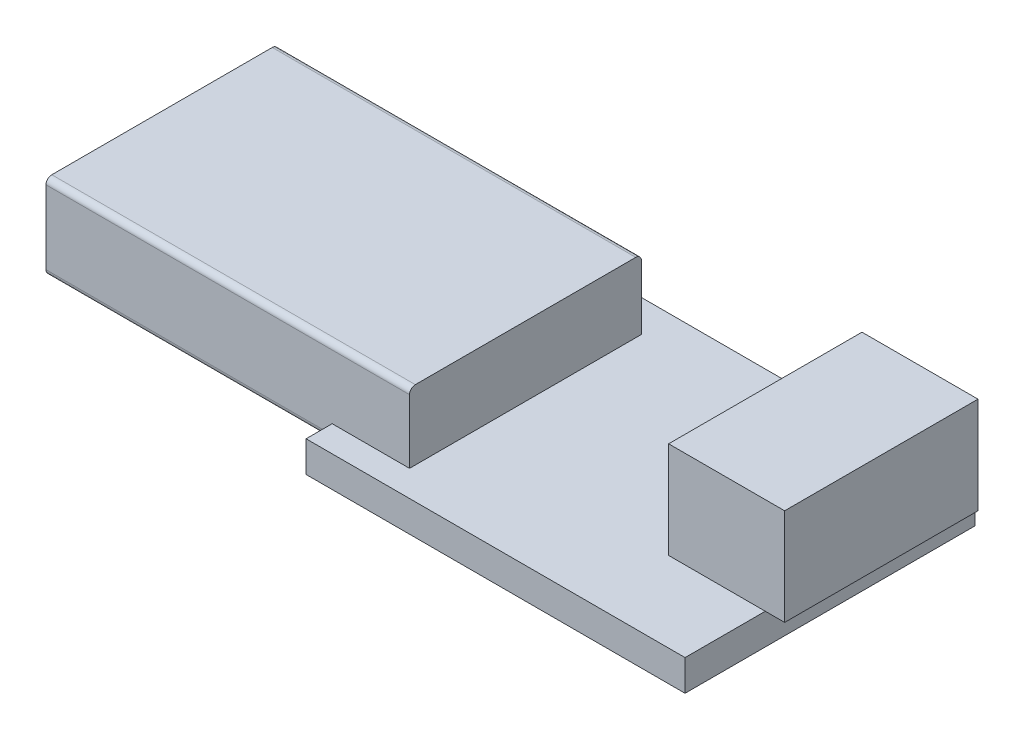
ISO-10303-21;
HEADER;
FILE_DESCRIPTION(('STEP AP214'),'2;1');
FILE_NAME('part.step','',(''),(''),'','','');
FILE_SCHEMA(('AUTOMOTIVE_DESIGN { 1 0 10303 214 1 1 1 1 }'));
ENDSEC;
DATA;
#1=APPLICATION_CONTEXT('core data for automotive mechanical design processes');
#2=APPLICATION_PROTOCOL_DEFINITION('international standard','automotive_design',2000,#1);
#3=PRODUCT_CONTEXT('',#1,'mechanical');
#4=PRODUCT('Part','Part','',(#3));
#5=PRODUCT_RELATED_PRODUCT_CATEGORY('part','',(#4));
#6=PRODUCT_DEFINITION_FORMATION('','',#4);
#7=PRODUCT_DEFINITION_CONTEXT('part definition',#1,'design');
#8=PRODUCT_DEFINITION('design','',#6,#7);
#9=PRODUCT_DEFINITION_SHAPE('','',#8);
#10=(LENGTH_UNIT() NAMED_UNIT(*) SI_UNIT(.MILLI.,.METRE.));
#11=(NAMED_UNIT(*) PLANE_ANGLE_UNIT() SI_UNIT($,.RADIAN.));
#12=(NAMED_UNIT(*) SI_UNIT($,.STERADIAN.) SOLID_ANGLE_UNIT());
#13=UNCERTAINTY_MEASURE_WITH_UNIT(LENGTH_MEASURE(1.E-05),#10,'distance_accuracy_value','');
#14=(GEOMETRIC_REPRESENTATION_CONTEXT(3) GLOBAL_UNCERTAINTY_ASSIGNED_CONTEXT((#13)) GLOBAL_UNIT_ASSIGNED_CONTEXT((#10,
#11,#12)) REPRESENTATION_CONTEXT('',''));
#15=CARTESIAN_POINT('',(0.,0.,0.));
#16=DIRECTION('',(0.,0.,1.));
#17=DIRECTION('',(1.,0.,0.));
#18=AXIS2_PLACEMENT_3D('',#15,#16,#17);
#19=CARTESIAN_POINT('',(6.21665510863984,0.3,-5.55));
#20=DIRECTION('',(0.,-1.,0.));
#21=DIRECTION('',(0.,0.,-1.));
#22=AXIS2_PLACEMENT_3D('',#19,#20,#21);
#23=PLANE('',#22);
#24=DIRECTION('',(0.,0.,-1.));
#25=VECTOR('',#24,1.);
#26=CARTESIAN_POINT('',(-24.5,0.3,5.55));
#27=LINE('',#26,#25);
#28=CARTESIAN_POINT('',(-24.5,0.3,5.55));
#29=VERTEX_POINT('',#28);
#30=CARTESIAN_POINT('',(-24.5,0.3,-5.25));
#31=VERTEX_POINT('',#30);
#32=EDGE_CURVE('E241',#29,#31,#27,.T.);
#33=ORIENTED_EDGE('',*,*,#32,.T.);
#34=DIRECTION('',(-1.,0.,0.));
#35=VECTOR('',#34,1.);
#36=CARTESIAN_POINT('',(-24.6,0.3,-5.25));
#37=LINE('',#36,#35);
#38=CARTESIAN_POINT('',(-24.6,0.3,-5.25));
#39=VERTEX_POINT('',#38);
#40=EDGE_CURVE('E226',#31,#39,#37,.T.);
#41=ORIENTED_EDGE('',*,*,#40,.T.);
#42=DIRECTION('',(0.,0.,1.));
#43=VECTOR('',#42,1.);
#44=CARTESIAN_POINT('',(-24.6,0.3,-5.55));
#45=LINE('',#44,#43);
#46=CARTESIAN_POINT('',(-24.6,0.3,5.55));
#47=VERTEX_POINT('',#46);
#48=EDGE_CURVE('E298',#39,#47,#45,.T.);
#49=ORIENTED_EDGE('',*,*,#48,.T.);
#50=DIRECTION('',(-1.,0.,0.));
#51=VECTOR('',#50,1.);
#52=CARTESIAN_POINT('',(-7.8,0.3,5.55));
#53=LINE('',#52,#51);
#54=EDGE_CURVE('E236',#47,#29,#53,.F.);
#55=ORIENTED_EDGE('',*,*,#54,.T.);
#56=EDGE_LOOP('',(#33,#41,#49,#55));
#57=FACE_BOUND('',#56,.T.);
#58=ADVANCED_FACE('F35',(#57),#23,.F.);
#59=CARTESIAN_POINT('',(6.21665510863984,4.1,-5.55));
#60=DIRECTION('',(0.,0.,-1.));
#61=DIRECTION('',(-1.,0.,0.));
#62=AXIS2_PLACEMENT_3D('',#59,#60,#61);
#63=PLANE('',#62);
#64=DIRECTION('',(1.,0.,0.));
#65=VECTOR('',#64,1.);
#66=CARTESIAN_POINT('',(-36.1741090369842,2.3,-5.55));
#67=LINE('',#66,#65);
#68=CARTESIAN_POINT('',(-24.5,2.3,-5.55));
#69=VERTEX_POINT('',#68);
#70=CARTESIAN_POINT('',(-7.8,2.3,-5.55));
#71=VERTEX_POINT('',#70);
#72=EDGE_CURVE('E261',#69,#71,#67,.T.);
#73=ORIENTED_EDGE('',*,*,#72,.T.);
#74=DIRECTION('',(0.,1.,0.));
#75=VECTOR('',#74,1.);
#76=CARTESIAN_POINT('',(-7.8,4.1,-5.55));
#77=LINE('',#76,#75);
#78=CARTESIAN_POINT('',(-7.8,3.8,-5.55));
#79=VERTEX_POINT('',#78);
#80=EDGE_CURVE('E302',#71,#79,#77,.T.);
#81=ORIENTED_EDGE('',*,*,#80,.T.);
#82=DIRECTION('',(-1.,0.,0.));
#83=VECTOR('',#82,1.);
#84=CARTESIAN_POINT('',(-24.6,3.8,-5.55));
#85=LINE('',#84,#83);
#86=CARTESIAN_POINT('',(-24.6,3.8,-5.55));
#87=VERTEX_POINT('',#86);
#88=EDGE_CURVE('E401',#79,#87,#85,.T.);
#89=ORIENTED_EDGE('',*,*,#88,.T.);
#90=DIRECTION('',(0.,-1.,0.));
#91=VECTOR('',#90,1.);
#92=CARTESIAN_POINT('',(-24.6,4.1,-5.55));
#93=LINE('',#92,#91);
#94=CARTESIAN_POINT('',(-24.6,0.6,-5.55));
#95=VERTEX_POINT('',#94);
#96=EDGE_CURVE('E303',#87,#95,#93,.T.);
#97=ORIENTED_EDGE('',*,*,#96,.T.);
#98=DIRECTION('',(-1.,0.,0.));
#99=VECTOR('',#98,1.);
#100=CARTESIAN_POINT('',(-7.8,0.6,-5.55));
#101=LINE('',#100,#99);
#102=CARTESIAN_POINT('',(-24.5,0.6,-5.55));
#103=VERTEX_POINT('',#102);
#104=EDGE_CURVE('E399',#95,#103,#101,.F.);
#105=ORIENTED_EDGE('',*,*,#104,.T.);
#106=DIRECTION('',(0.,1.,0.));
#107=VECTOR('',#106,1.);
#108=CARTESIAN_POINT('',(-24.5,0.6,-5.55));
#109=LINE('',#108,#107);
#110=EDGE_CURVE('E50',#103,#69,#109,.T.);
#111=ORIENTED_EDGE('',*,*,#110,.T.);
#112=EDGE_LOOP('',(#73,#81,#89,#97,#105,#111));
#113=FACE_BOUND('',#112,.T.);
#114=ADVANCED_FACE('F525',(#113),#63,.F.);
#115=CARTESIAN_POINT('',(6.21665510863984,0.3,5.85));
#116=DIRECTION('',(0.,0.,1.));
#117=DIRECTION('',(1.,0.,0.));
#118=AXIS2_PLACEMENT_3D('',#115,#116,#117);
#119=PLANE('',#118);
#120=DIRECTION('',(1.,0.,0.));
#121=VECTOR('',#120,1.);
#122=CARTESIAN_POINT('',(-36.1741090369842,2.3,5.85));
#123=LINE('',#122,#121);
#124=CARTESIAN_POINT('',(-24.5,2.3,5.85));
#125=VERTEX_POINT('',#124);
#126=CARTESIAN_POINT('',(-7.8,2.3,5.85));
#127=VERTEX_POINT('',#126);
#128=EDGE_CURVE('E58',#125,#127,#123,.T.);
#129=ORIENTED_EDGE('',*,*,#128,.F.);
#130=DIRECTION('',(0.,-1.,0.));
#131=VECTOR('',#130,1.);
#132=CARTESIAN_POINT('',(-24.5,2.3,5.85));
#133=LINE('',#132,#131);
#134=CARTESIAN_POINT('',(-24.5,0.6,5.85));
#135=VERTEX_POINT('',#134);
#136=EDGE_CURVE('E253',#125,#135,#133,.T.);
#137=ORIENTED_EDGE('',*,*,#136,.T.);
#138=DIRECTION('',(-1.,0.,0.));
#139=VECTOR('',#138,1.);
#140=CARTESIAN_POINT('',(-24.6,0.6,5.85));
#141=LINE('',#140,#139);
#142=CARTESIAN_POINT('',(-24.6,0.6,5.85));
#143=VERTEX_POINT('',#142);
#144=EDGE_CURVE('E237',#135,#143,#141,.T.);
#145=ORIENTED_EDGE('',*,*,#144,.T.);
#146=DIRECTION('',(0.,1.,0.));
#147=VECTOR('',#146,1.);
#148=CARTESIAN_POINT('',(-24.6,0.3,5.85));
#149=LINE('',#148,#147);
#150=CARTESIAN_POINT('',(-24.6,3.8,5.85));
#151=VERTEX_POINT('',#150);
#152=EDGE_CURVE('E307',#143,#151,#149,.T.);
#153=ORIENTED_EDGE('',*,*,#152,.T.);
#154=DIRECTION('',(-1.,0.,0.));
#155=VECTOR('',#154,1.);
#156=CARTESIAN_POINT('',(-7.8,3.8,5.85));
#157=LINE('',#156,#155);
#158=CARTESIAN_POINT('',(-7.8,3.8,5.85));
#159=VERTEX_POINT('',#158);
#160=EDGE_CURVE('E385',#151,#159,#157,.F.);
#161=ORIENTED_EDGE('',*,*,#160,.T.);
#162=DIRECTION('',(0.,-1.,0.));
#163=VECTOR('',#162,1.);
#164=CARTESIAN_POINT('',(-7.8,0.3,5.85));
#165=LINE('',#164,#163);
#166=EDGE_CURVE('E305',#159,#127,#165,.T.);
#167=ORIENTED_EDGE('',*,*,#166,.T.);
#168=EDGE_LOOP('',(#129,#137,#145,#153,#161,#167));
#169=FACE_BOUND('',#168,.T.);
#170=ADVANCED_FACE('F530',(#169),#119,.F.);
#171=CARTESIAN_POINT('',(6.21665510863984,0.6,5.55));
#172=DIRECTION('',(1.,0.,0.));
#173=DIRECTION('',(0.,0.,-1.));
#174=AXIS2_PLACEMENT_3D('',#171,#172,#173);
#175=CYLINDRICAL_SURFACE('',#174,0.3);
#176=CARTESIAN_POINT('',(-24.5,0.6,5.55));
#177=DIRECTION('',(1.,0.,0.));
#178=DIRECTION('',(0.,0.,-1.));
#179=AXIS2_PLACEMENT_3D('',#176,#177,#178);
#180=CIRCLE('',#179,0.3);
#181=EDGE_CURVE('E255',#135,#29,#180,.T.);
#182=ORIENTED_EDGE('',*,*,#181,.T.);
#183=ORIENTED_EDGE('',*,*,#54,.F.);
#184=CARTESIAN_POINT('',(-24.6,0.6,5.55));
#185=DIRECTION('',(1.,0.,0.));
#186=DIRECTION('',(0.,0.,-1.));
#187=AXIS2_PLACEMENT_3D('',#184,#185,#186);
#188=CIRCLE('',#187,0.3);
#189=EDGE_CURVE('E436',#143,#47,#188,.T.);
#190=ORIENTED_EDGE('',*,*,#189,.F.);
#191=ORIENTED_EDGE('',*,*,#144,.F.);
#192=EDGE_LOOP('',(#182,#183,#190,#191));
#193=FACE_BOUND('',#192,.T.);
#194=ADVANCED_FACE('F552',(#193),#175,.F.);
#195=CARTESIAN_POINT('',(6.21665510863984,0.6,-5.25));
#196=DIRECTION('',(1.,0.,0.));
#197=DIRECTION('',(0.,0.,-1.));
#198=AXIS2_PLACEMENT_3D('',#195,#196,#197);
#199=CYLINDRICAL_SURFACE('',#198,0.3);
#200=CARTESIAN_POINT('',(-24.5,0.6,-5.25));
#201=DIRECTION('',(1.,0.,0.));
#202=DIRECTION('',(0.,0.,-1.));
#203=AXIS2_PLACEMENT_3D('',#200,#201,#202);
#204=CIRCLE('',#203,0.3);
#205=EDGE_CURVE('E231',#31,#103,#204,.T.);
#206=ORIENTED_EDGE('',*,*,#205,.T.);
#207=ORIENTED_EDGE('',*,*,#104,.F.);
#208=CARTESIAN_POINT('',(-24.6,0.6,-5.25));
#209=DIRECTION('',(1.,0.,0.));
#210=DIRECTION('',(0.,0.,-1.));
#211=AXIS2_PLACEMENT_3D('',#208,#209,#210);
#212=CIRCLE('',#211,0.3);
#213=EDGE_CURVE('E232',#39,#95,#212,.T.);
#214=ORIENTED_EDGE('',*,*,#213,.F.);
#215=ORIENTED_EDGE('',*,*,#40,.F.);
#216=EDGE_LOOP('',(#206,#207,#214,#215));
#217=FACE_BOUND('',#216,.T.);
#218=ADVANCED_FACE('F228',(#217),#199,.F.);
#219=CARTESIAN_POINT('',(0.,0.8,0.));
#220=DIRECTION('',(0.,-1.,0.));
#221=DIRECTION('',(0.,0.,-1.));
#222=AXIS2_PLACEMENT_3D('',#219,#220,#221);
#223=PLANE('',#222);
#224=DIRECTION('',(-1.,0.,0.));
#225=VECTOR('',#224,1.);
#226=CARTESIAN_POINT('',(10.8,0.8,-6.65));
#227=LINE('',#226,#225);
#228=CARTESIAN_POINT('',(9.8,0.8,-6.65));
#229=VERTEX_POINT('',#228);
#230=CARTESIAN_POINT('',(4.8,0.8,-6.65));
#231=VERTEX_POINT('',#230);
#232=EDGE_CURVE('E277',#229,#231,#227,.T.);
#233=ORIENTED_EDGE('',*,*,#232,.F.);
#234=DIRECTION('',(0.,0.,-1.));
#235=VECTOR('',#234,1.);
#236=CARTESIAN_POINT('',(9.8,0.8,7.5));
#237=LINE('',#236,#235);
#238=CARTESIAN_POINT('',(9.8,0.8,-7.5));
#239=VERTEX_POINT('',#238);
#240=EDGE_CURVE('E346',#229,#239,#237,.T.);
#241=ORIENTED_EDGE('',*,*,#240,.T.);
#242=DIRECTION('',(-1.,0.,0.));
#243=VECTOR('',#242,1.);
#244=CARTESIAN_POINT('',(-9.8,0.8,-7.5));
#245=LINE('',#244,#243);
#246=CARTESIAN_POINT('',(-9.8,0.8,-7.5));
#247=VERTEX_POINT('',#246);
#248=EDGE_CURVE('E344',#239,#247,#245,.T.);
#249=ORIENTED_EDGE('',*,*,#248,.T.);
#250=DIRECTION('',(0.,0.,1.));
#251=VECTOR('',#250,1.);
#252=CARTESIAN_POINT('',(-9.8,0.8,7.5));
#253=LINE('',#252,#251);
#254=CARTESIAN_POINT('',(-9.8,0.8,-5.85));
#255=VERTEX_POINT('',#254);
#256=EDGE_CURVE('E349',#247,#255,#253,.T.);
#257=ORIENTED_EDGE('',*,*,#256,.T.);
#258=DIRECTION('',(-1.,0.,0.));
#259=VECTOR('',#258,1.);
#260=CARTESIAN_POINT('',(0.,0.8,-5.85));
#261=LINE('',#260,#259);
#262=CARTESIAN_POINT('',(-5.8,0.8,-5.85));
#263=VERTEX_POINT('',#262);
#264=EDGE_CURVE('E373',#263,#255,#261,.T.);
#265=ORIENTED_EDGE('',*,*,#264,.F.);
#266=DIRECTION('',(0.,0.,-1.));
#267=VECTOR('',#266,1.);
#268=CARTESIAN_POINT('',(-5.8,0.8,0.));
#269=LINE('',#268,#267);
#270=CARTESIAN_POINT('',(-5.8,0.8,6.15));
#271=VERTEX_POINT('',#270);
#272=EDGE_CURVE('E376',#271,#263,#269,.T.);
#273=ORIENTED_EDGE('',*,*,#272,.F.);
#274=DIRECTION('',(1.,0.,0.));
#275=VECTOR('',#274,1.);
#276=CARTESIAN_POINT('',(0.,0.8,6.15));
#277=LINE('',#276,#275);
#278=CARTESIAN_POINT('',(-9.8,0.8,6.15));
#279=VERTEX_POINT('',#278);
#280=EDGE_CURVE('E379',#279,#271,#277,.T.);
#281=ORIENTED_EDGE('',*,*,#280,.F.);
#282=CARTESIAN_POINT('',(-9.8,0.8,7.5));
#283=VERTEX_POINT('',#282);
#284=EDGE_CURVE('E348',#279,#283,#253,.T.);
#285=ORIENTED_EDGE('',*,*,#284,.T.);
#286=DIRECTION('',(1.,0.,0.));
#287=VECTOR('',#286,1.);
#288=CARTESIAN_POINT('',(-9.8,0.8,7.5));
#289=LINE('',#288,#287);
#290=CARTESIAN_POINT('',(9.8,0.8,7.5));
#291=VERTEX_POINT('',#290);
#292=EDGE_CURVE('E351',#283,#291,#289,.T.);
#293=ORIENTED_EDGE('',*,*,#292,.T.);
#294=CARTESIAN_POINT('',(9.8,0.8,3.35));
#295=VERTEX_POINT('',#294);
#296=EDGE_CURVE('E341',#291,#295,#237,.T.);
#297=ORIENTED_EDGE('',*,*,#296,.T.);
#298=DIRECTION('',(1.,0.,0.));
#299=VECTOR('',#298,1.);
#300=CARTESIAN_POINT('',(10.8,0.8,3.35));
#301=LINE('',#300,#299);
#302=CARTESIAN_POINT('',(4.8,0.8,3.35));
#303=VERTEX_POINT('',#302);
#304=EDGE_CURVE('E268',#303,#295,#301,.T.);
#305=ORIENTED_EDGE('',*,*,#304,.F.);
#306=DIRECTION('',(0.,0.,1.));
#307=VECTOR('',#306,1.);
#308=CARTESIAN_POINT('',(4.8,0.8,-6.65));
#309=LINE('',#308,#307);
#310=EDGE_CURVE('E281',#231,#303,#309,.T.);
#311=ORIENTED_EDGE('',*,*,#310,.F.);
#312=EDGE_LOOP('',(#233,#241,#249,#257,#265,#273,#281,#285,#293,#297,#305,#311));
#313=FACE_BOUND('',#312,.T.);
#314=ADVANCED_FACE('F491',(#313),#223,.F.);
#315=CARTESIAN_POINT('',(-9.8,0.8,7.5));
#316=DIRECTION('',(1.,0.,0.));
#317=DIRECTION('',(0.,0.,-1.));
#318=AXIS2_PLACEMENT_3D('',#315,#316,#317);
#319=PLANE('',#318);
#320=DIRECTION('',(0.,1.,0.));
#321=VECTOR('',#320,1.);
#322=CARTESIAN_POINT('',(-9.8,0.8,6.15));
#323=LINE('',#322,#321);
#324=CARTESIAN_POINT('',(-9.8,0.3,6.15));
#325=VERTEX_POINT('',#324);
#326=EDGE_CURVE('E338',#325,#279,#323,.T.);
#327=ORIENTED_EDGE('',*,*,#326,.F.);
#328=CARTESIAN_POINT('',(-9.8,0.3,5.85));
#329=DIRECTION('',(1.,0.,0.));
#330=DIRECTION('',(0.,0.,-1.));
#331=AXIS2_PLACEMENT_3D('',#328,#329,#330);
#332=CIRCLE('',#331,0.3);
#333=CARTESIAN_POINT('',(-9.8,0.,5.85));
#334=VERTEX_POINT('',#333);
#335=EDGE_CURVE('E12',#325,#334,#332,.T.);
#336=ORIENTED_EDGE('',*,*,#335,.T.);
#337=DIRECTION('',(0.,0.,1.));
#338=VECTOR('',#337,1.);
#339=CARTESIAN_POINT('',(-9.8,0.,7.5));
#340=LINE('',#339,#338);
#341=CARTESIAN_POINT('',(-9.8,0.,-5.55));
#342=VERTEX_POINT('',#341);
#343=EDGE_CURVE('E382',#342,#334,#340,.T.);
#344=ORIENTED_EDGE('',*,*,#343,.F.);
#345=CARTESIAN_POINT('',(-9.8,0.3,-5.55));
#346=DIRECTION('',(1.,0.,0.));
#347=DIRECTION('',(0.,0.,-1.));
#348=AXIS2_PLACEMENT_3D('',#345,#346,#347);
#349=CIRCLE('',#348,0.3);
#350=CARTESIAN_POINT('',(-9.8,0.3,-5.85));
#351=VERTEX_POINT('',#350);
#352=EDGE_CURVE('E43',#342,#351,#349,.T.);
#353=ORIENTED_EDGE('',*,*,#352,.T.);
#354=DIRECTION('',(0.,-1.,0.));
#355=VECTOR('',#354,1.);
#356=CARTESIAN_POINT('',(-9.8,0.8,-5.85));
#357=LINE('',#356,#355);
#358=EDGE_CURVE('E335',#255,#351,#357,.T.);
#359=ORIENTED_EDGE('',*,*,#358,.F.);
#360=ORIENTED_EDGE('',*,*,#256,.F.);
#361=DIRECTION('',(0.,-1.,0.));
#362=VECTOR('',#361,1.);
#363=CARTESIAN_POINT('',(-9.8,0.8,-7.5));
#364=LINE('',#363,#362);
#365=CARTESIAN_POINT('',(-9.8,-0.8,-7.5));
#366=VERTEX_POINT('',#365);
#367=EDGE_CURVE('E367',#247,#366,#364,.T.);
#368=ORIENTED_EDGE('',*,*,#367,.T.);
#369=DIRECTION('',(0.,0.,1.));
#370=VECTOR('',#369,1.);
#371=CARTESIAN_POINT('',(-9.8,-0.8,7.5));
#372=LINE('',#371,#370);
#373=CARTESIAN_POINT('',(-9.8,-0.8,7.5));
#374=VERTEX_POINT('',#373);
#375=EDGE_CURVE('E358',#366,#374,#372,.T.);
#376=ORIENTED_EDGE('',*,*,#375,.T.);
#377=DIRECTION('',(0.,-1.,0.));
#378=VECTOR('',#377,1.);
#379=CARTESIAN_POINT('',(-9.8,0.8,7.5));
#380=LINE('',#379,#378);
#381=EDGE_CURVE('E364',#283,#374,#380,.T.);
#382=ORIENTED_EDGE('',*,*,#381,.F.);
#383=ORIENTED_EDGE('',*,*,#284,.F.);
#384=EDGE_LOOP('',(#327,#336,#344,#353,#359,#360,#368,#376,#382,#383));
#385=FACE_BOUND('',#384,.T.);
#386=ADVANCED_FACE('F447',(#385),#319,.F.);
#387=CARTESIAN_POINT('',(9.8,0.8,7.5));
#388=DIRECTION('',(-1.,0.,0.));
#389=DIRECTION('',(0.,0.,1.));
#390=AXIS2_PLACEMENT_3D('',#387,#388,#389);
#391=PLANE('',#390);
#392=DIRECTION('',(0.,0.,-1.));
#393=VECTOR('',#392,1.);
#394=CARTESIAN_POINT('',(9.8,-0.8,7.5));
#395=LINE('',#394,#393);
#396=CARTESIAN_POINT('',(9.8,-0.8,7.5));
#397=VERTEX_POINT('',#396);
#398=CARTESIAN_POINT('',(9.8,-0.8,-7.5));
#399=VERTEX_POINT('',#398);
#400=EDGE_CURVE('E340',#397,#399,#395,.T.);
#401=ORIENTED_EDGE('',*,*,#400,.T.);
#402=DIRECTION('',(0.,-1.,0.));
#403=VECTOR('',#402,1.);
#404=CARTESIAN_POINT('',(9.8,0.8,-7.5));
#405=LINE('',#404,#403);
#406=EDGE_CURVE('E370',#239,#399,#405,.T.);
#407=ORIENTED_EDGE('',*,*,#406,.F.);
#408=ORIENTED_EDGE('',*,*,#240,.F.);
#409=EDGE_CURVE('E345',#295,#229,#237,.T.);
#410=ORIENTED_EDGE('',*,*,#409,.F.);
#411=ORIENTED_EDGE('',*,*,#296,.F.);
#412=DIRECTION('',(0.,-1.,0.));
#413=VECTOR('',#412,1.);
#414=CARTESIAN_POINT('',(9.8,0.8,7.5));
#415=LINE('',#414,#413);
#416=EDGE_CURVE('E353',#291,#397,#415,.T.);
#417=ORIENTED_EDGE('',*,*,#416,.T.);
#418=EDGE_LOOP('',(#401,#407,#408,#410,#411,#417));
#419=FACE_BOUND('',#418,.T.);
#420=ADVANCED_FACE('F503',(#419),#391,.F.);
#421=CARTESIAN_POINT('',(-9.8,0.8,-7.5));
#422=DIRECTION('',(0.,0.,1.));
#423=DIRECTION('',(1.,0.,0.));
#424=AXIS2_PLACEMENT_3D('',#421,#422,#423);
#425=PLANE('',#424);
#426=DIRECTION('',(-1.,0.,0.));
#427=VECTOR('',#426,1.);
#428=CARTESIAN_POINT('',(-9.8,-0.8,-7.5));
#429=LINE('',#428,#427);
#430=EDGE_CURVE('E356',#399,#366,#429,.T.);
#431=ORIENTED_EDGE('',*,*,#430,.T.);
#432=ORIENTED_EDGE('',*,*,#367,.F.);
#433=ORIENTED_EDGE('',*,*,#248,.F.);
#434=ORIENTED_EDGE('',*,*,#406,.T.);
#435=EDGE_LOOP('',(#431,#432,#433,#434));
#436=FACE_BOUND('',#435,.T.);
#437=ADVANCED_FACE('F511',(#436),#425,.F.);
#438=CARTESIAN_POINT('',(-9.8,0.8,7.5));
#439=DIRECTION('',(0.,0.,-1.));
#440=DIRECTION('',(-1.,0.,0.));
#441=AXIS2_PLACEMENT_3D('',#438,#439,#440);
#442=PLANE('',#441);
#443=DIRECTION('',(1.,0.,0.));
#444=VECTOR('',#443,1.);
#445=CARTESIAN_POINT('',(-9.8,-0.8,7.5));
#446=LINE('',#445,#444);
#447=EDGE_CURVE('E360',#374,#397,#446,.T.);
#448=ORIENTED_EDGE('',*,*,#447,.T.);
#449=ORIENTED_EDGE('',*,*,#416,.F.);
#450=ORIENTED_EDGE('',*,*,#292,.F.);
#451=ORIENTED_EDGE('',*,*,#381,.T.);
#452=EDGE_LOOP('',(#448,#449,#450,#451));
#453=FACE_BOUND('',#452,.T.);
#454=ADVANCED_FACE('F499',(#453),#442,.F.);
#455=CARTESIAN_POINT('',(0.,-0.8,0.));
#456=DIRECTION('',(0.,-1.,0.));
#457=DIRECTION('',(0.,0.,-1.));
#458=AXIS2_PLACEMENT_3D('',#455,#456,#457);
#459=PLANE('',#458);
#460=ORIENTED_EDGE('',*,*,#400,.F.);
#461=ORIENTED_EDGE('',*,*,#447,.F.);
#462=ORIENTED_EDGE('',*,*,#375,.F.);
#463=ORIENTED_EDGE('',*,*,#430,.F.);
#464=EDGE_LOOP('',(#460,#461,#462,#463));
#465=FACE_BOUND('',#464,.T.);
#466=ADVANCED_FACE('F513',(#465),#459,.T.);
#467=CARTESIAN_POINT('',(0.,0.,0.));
#468=DIRECTION('',(0.,1.,0.));
#469=DIRECTION('',(0.,0.,1.));
#470=AXIS2_PLACEMENT_3D('',#467,#468,#469);
#471=PLANE('',#470);
#472=DIRECTION('',(0.,0.,1.));
#473=VECTOR('',#472,1.);
#474=CARTESIAN_POINT('',(-24.6,0.,-5.85));
#475=LINE('',#474,#473);
#476=CARTESIAN_POINT('',(-24.6,0.,-5.55));
#477=VERTEX_POINT('',#476);
#478=CARTESIAN_POINT('',(-24.6,0.,5.85));
#479=VERTEX_POINT('',#478);
#480=EDGE_CURVE('E316',#477,#479,#475,.T.);
#481=ORIENTED_EDGE('',*,*,#480,.F.);
#482=DIRECTION('',(-1.,0.,0.));
#483=VECTOR('',#482,1.);
#484=CARTESIAN_POINT('',(0.,0.,-5.55));
#485=LINE('',#484,#483);
#486=EDGE_CURVE('E419',#477,#342,#485,.F.);
#487=ORIENTED_EDGE('',*,*,#486,.T.);
#488=ORIENTED_EDGE('',*,*,#343,.T.);
#489=DIRECTION('',(1.,0.,0.));
#490=VECTOR('',#489,1.);
#491=CARTESIAN_POINT('',(0.,0.,5.85));
#492=LINE('',#491,#490);
#493=EDGE_CURVE('E417',#334,#479,#492,.F.);
#494=ORIENTED_EDGE('',*,*,#493,.T.);
#495=EDGE_LOOP('',(#481,#487,#488,#494));
#496=FACE_BOUND('',#495,.T.);
#497=ADVANCED_FACE('F462',(#496),#471,.F.);
#498=CARTESIAN_POINT('',(-24.6,4.4,6.15));
#499=DIRECTION('',(0.,0.,-1.));
#500=DIRECTION('',(-1.,0.,0.));
#501=AXIS2_PLACEMENT_3D('',#498,#499,#500);
#502=PLANE('',#501);
#503=DIRECTION('',(0.,-1.,0.));
#504=VECTOR('',#503,1.);
#505=CARTESIAN_POINT('',(-24.6,4.4,6.15));
#506=LINE('',#505,#504);
#507=CARTESIAN_POINT('',(-24.6,4.1,6.15));
#508=VERTEX_POINT('',#507);
#509=CARTESIAN_POINT('',(-24.6,0.3,6.15));
#510=VERTEX_POINT('',#509);
#511=EDGE_CURVE('E332',#508,#510,#506,.T.);
#512=ORIENTED_EDGE('',*,*,#511,.T.);
#513=DIRECTION('',(1.,0.,0.));
#514=VECTOR('',#513,1.);
#515=CARTESIAN_POINT('',(-24.6,0.3,6.15));
#516=LINE('',#515,#514);
#517=EDGE_CURVE('E433',#510,#325,#516,.T.);
#518=ORIENTED_EDGE('',*,*,#517,.T.);
#519=ORIENTED_EDGE('',*,*,#326,.T.);
#520=ORIENTED_EDGE('',*,*,#280,.T.);
#521=DIRECTION('',(0.,-1.,0.));
#522=VECTOR('',#521,1.);
#523=CARTESIAN_POINT('',(-5.8,4.4,6.15));
#524=LINE('',#523,#522);
#525=CARTESIAN_POINT('',(-5.8,4.1,6.15));
#526=VERTEX_POINT('',#525);
#527=EDGE_CURVE('E330',#526,#271,#524,.T.);
#528=ORIENTED_EDGE('',*,*,#527,.F.);
#529=DIRECTION('',(1.,0.,0.));
#530=VECTOR('',#529,1.);
#531=CARTESIAN_POINT('',(-24.6,4.1,6.15));
#532=LINE('',#531,#530);
#533=EDGE_CURVE('E431',#526,#508,#532,.F.);
#534=ORIENTED_EDGE('',*,*,#533,.T.);
#535=EDGE_LOOP('',(#512,#518,#519,#520,#528,#534));
#536=FACE_BOUND('',#535,.T.);
#537=ADVANCED_FACE('F470',(#536),#502,.F.);
#538=CARTESIAN_POINT('',(-5.8,4.4,-5.85));
#539=DIRECTION('',(-1.,0.,0.));
#540=DIRECTION('',(0.,0.,1.));
#541=AXIS2_PLACEMENT_3D('',#538,#539,#540);
#542=PLANE('',#541);
#543=DIRECTION('',(0.,-1.,0.));
#544=VECTOR('',#543,1.);
#545=CARTESIAN_POINT('',(-5.8,4.4,-5.85));
#546=LINE('',#545,#544);
#547=CARTESIAN_POINT('',(-5.8,4.1,-5.85));
#548=VERTEX_POINT('',#547);
#549=EDGE_CURVE('E328',#548,#263,#546,.T.);
#550=ORIENTED_EDGE('',*,*,#549,.F.);
#551=CARTESIAN_POINT('',(-5.8,4.1,-5.55));
#552=DIRECTION('',(-1.,0.,0.));
#553=DIRECTION('',(0.,0.,1.));
#554=AXIS2_PLACEMENT_3D('',#551,#552,#553);
#555=CIRCLE('',#554,0.3);
#556=CARTESIAN_POINT('',(-5.8,4.4,-5.55));
#557=VERTEX_POINT('',#556);
#558=EDGE_CURVE('E429',#548,#557,#555,.F.);
#559=ORIENTED_EDGE('',*,*,#558,.T.);
#560=DIRECTION('',(0.,0.,-1.));
#561=VECTOR('',#560,1.);
#562=CARTESIAN_POINT('',(-5.8,4.4,-5.85));
#563=LINE('',#562,#561);
#564=CARTESIAN_POINT('',(-5.8,4.4,5.85));
#565=VERTEX_POINT('',#564);
#566=EDGE_CURVE('E320',#565,#557,#563,.T.);
#567=ORIENTED_EDGE('',*,*,#566,.F.);
#568=CARTESIAN_POINT('',(-5.8,4.1,5.85));
#569=DIRECTION('',(-1.,0.,0.));
#570=DIRECTION('',(0.,0.,1.));
#571=AXIS2_PLACEMENT_3D('',#568,#569,#570);
#572=CIRCLE('',#571,0.3);
#573=EDGE_CURVE('E427',#565,#526,#572,.F.);
#574=ORIENTED_EDGE('',*,*,#573,.T.);
#575=ORIENTED_EDGE('',*,*,#527,.T.);
#576=ORIENTED_EDGE('',*,*,#272,.T.);
#577=EDGE_LOOP('',(#550,#559,#567,#574,#575,#576));
#578=FACE_BOUND('',#577,.T.);
#579=ADVANCED_FACE('F486',(#578),#542,.F.);
#580=CARTESIAN_POINT('',(-24.6,4.4,-5.85));
#581=DIRECTION('',(0.,0.,1.));
#582=DIRECTION('',(1.,0.,0.));
#583=AXIS2_PLACEMENT_3D('',#580,#581,#582);
#584=PLANE('',#583);
#585=ORIENTED_EDGE('',*,*,#358,.T.);
#586=DIRECTION('',(-1.,0.,0.));
#587=VECTOR('',#586,1.);
#588=CARTESIAN_POINT('',(-24.6,0.3,-5.85));
#589=LINE('',#588,#587);
#590=CARTESIAN_POINT('',(-24.6,0.3,-5.85));
#591=VERTEX_POINT('',#590);
#592=EDGE_CURVE('E406',#351,#591,#589,.T.);
#593=ORIENTED_EDGE('',*,*,#592,.T.);
#594=DIRECTION('',(0.,-1.,0.));
#595=VECTOR('',#594,1.);
#596=CARTESIAN_POINT('',(-24.6,4.4,-5.85));
#597=LINE('',#596,#595);
#598=CARTESIAN_POINT('',(-24.6,4.1,-5.85));
#599=VERTEX_POINT('',#598);
#600=EDGE_CURVE('E323',#599,#591,#597,.T.);
#601=ORIENTED_EDGE('',*,*,#600,.F.);
#602=DIRECTION('',(-1.,0.,0.));
#603=VECTOR('',#602,1.);
#604=CARTESIAN_POINT('',(-5.8,4.1,-5.85));
#605=LINE('',#604,#603);
#606=EDGE_CURVE('E404',#599,#548,#605,.F.);
#607=ORIENTED_EDGE('',*,*,#606,.T.);
#608=ORIENTED_EDGE('',*,*,#549,.T.);
#609=ORIENTED_EDGE('',*,*,#264,.T.);
#610=EDGE_LOOP('',(#585,#593,#601,#607,#608,#609));
#611=FACE_BOUND('',#610,.T.);
#612=ADVANCED_FACE('F453',(#611),#584,.F.);
#613=CARTESIAN_POINT('',(-24.6,4.4,-5.85));
#614=DIRECTION('',(1.,0.,0.));
#615=DIRECTION('',(0.,0.,-1.));
#616=AXIS2_PLACEMENT_3D('',#613,#614,#615);
#617=PLANE('',#616);
#618=ORIENTED_EDGE('',*,*,#152,.F.);
#619=ORIENTED_EDGE('',*,*,#189,.T.);
#620=ORIENTED_EDGE('',*,*,#48,.F.);
#621=ORIENTED_EDGE('',*,*,#213,.T.);
#622=ORIENTED_EDGE('',*,*,#96,.F.);
#623=CARTESIAN_POINT('',(-24.6,3.8,-5.25));
#624=DIRECTION('',(1.,0.,0.));
#625=DIRECTION('',(0.,0.,-1.));
#626=AXIS2_PLACEMENT_3D('',#623,#624,#625);
#627=CIRCLE('',#626,0.3);
#628=CARTESIAN_POINT('',(-24.6,4.1,-5.25));
#629=VERTEX_POINT('',#628);
#630=EDGE_CURVE('E440',#87,#629,#627,.T.);
#631=ORIENTED_EDGE('',*,*,#630,.T.);
#632=DIRECTION('',(0.,0.,-1.));
#633=VECTOR('',#632,1.);
#634=CARTESIAN_POINT('',(-24.6,4.1,5.85));
#635=LINE('',#634,#633);
#636=CARTESIAN_POINT('',(-24.6,4.1,5.55));
#637=VERTEX_POINT('',#636);
#638=EDGE_CURVE('E310',#637,#629,#635,.T.);
#639=ORIENTED_EDGE('',*,*,#638,.F.);
#640=CARTESIAN_POINT('',(-24.6,3.8,5.55));
#641=DIRECTION('',(1.,0.,0.));
#642=DIRECTION('',(0.,0.,-1.));
#643=AXIS2_PLACEMENT_3D('',#640,#641,#642);
#644=CIRCLE('',#643,0.3);
#645=EDGE_CURVE('E438',#637,#151,#644,.T.);
#646=ORIENTED_EDGE('',*,*,#645,.T.);
#647=EDGE_LOOP('',(#618,#619,#620,#621,#622,#631,#639,#646));
#648=FACE_BOUND('',#647,.T.);
#649=ORIENTED_EDGE('',*,*,#600,.T.);
#650=CARTESIAN_POINT('',(-24.6,0.3,-5.55));
#651=DIRECTION('',(1.,0.,0.));
#652=DIRECTION('',(0.,0.,-1.));
#653=AXIS2_PLACEMENT_3D('',#650,#651,#652);
#654=CIRCLE('',#653,0.3);
#655=EDGE_CURVE('E415',#591,#477,#654,.F.);
#656=ORIENTED_EDGE('',*,*,#655,.T.);
#657=ORIENTED_EDGE('',*,*,#480,.T.);
#658=CARTESIAN_POINT('',(-24.6,0.3,5.85));
#659=DIRECTION('',(1.,0.,0.));
#660=DIRECTION('',(0.,0.,-1.));
#661=AXIS2_PLACEMENT_3D('',#658,#659,#660);
#662=CIRCLE('',#661,0.3);
#663=EDGE_CURVE('E411',#479,#510,#662,.F.);
#664=ORIENTED_EDGE('',*,*,#663,.T.);
#665=ORIENTED_EDGE('',*,*,#511,.F.);
#666=CARTESIAN_POINT('',(-24.6,4.1,5.85));
#667=DIRECTION('',(1.,0.,0.));
#668=DIRECTION('',(0.,0.,-1.));
#669=AXIS2_PLACEMENT_3D('',#666,#667,#668);
#670=CIRCLE('',#669,0.3);
#671=CARTESIAN_POINT('',(-24.6,4.4,5.85));
#672=VERTEX_POINT('',#671);
#673=EDGE_CURVE('E409',#508,#672,#670,.F.);
#674=ORIENTED_EDGE('',*,*,#673,.T.);
#675=DIRECTION('',(0.,0.,1.));
#676=VECTOR('',#675,1.);
#677=CARTESIAN_POINT('',(-24.6,4.4,-5.85));
#678=LINE('',#677,#676);
#679=CARTESIAN_POINT('',(-24.6,4.4,-5.55));
#680=VERTEX_POINT('',#679);
#681=EDGE_CURVE('E317',#680,#672,#678,.T.);
#682=ORIENTED_EDGE('',*,*,#681,.F.);
#683=CARTESIAN_POINT('',(-24.6,4.1,-5.55));
#684=DIRECTION('',(1.,0.,0.));
#685=DIRECTION('',(0.,0.,-1.));
#686=AXIS2_PLACEMENT_3D('',#683,#684,#685);
#687=CIRCLE('',#686,0.3);
#688=EDGE_CURVE('E413',#680,#599,#687,.F.);
#689=ORIENTED_EDGE('',*,*,#688,.T.);
#690=EDGE_LOOP('',(#649,#656,#657,#664,#665,#674,#682,#689));
#691=FACE_BOUND('',#690,.T.);
#692=ADVANCED_FACE('F459',(#648,#691),#617,.F.);
#693=CARTESIAN_POINT('',(0.,4.4,0.));
#694=DIRECTION('',(0.,1.,0.));
#695=DIRECTION('',(0.,0.,1.));
#696=AXIS2_PLACEMENT_3D('',#693,#694,#695);
#697=PLANE('',#696);
#698=ORIENTED_EDGE('',*,*,#566,.T.);
#699=DIRECTION('',(-1.,0.,0.));
#700=VECTOR('',#699,1.);
#701=CARTESIAN_POINT('',(-24.6,4.4,-5.55));
#702=LINE('',#701,#700);
#703=EDGE_CURVE('E424',#557,#680,#702,.T.);
#704=ORIENTED_EDGE('',*,*,#703,.T.);
#705=ORIENTED_EDGE('',*,*,#681,.T.);
#706=DIRECTION('',(1.,0.,0.));
#707=VECTOR('',#706,1.);
#708=CARTESIAN_POINT('',(-5.8,4.4,5.85));
#709=LINE('',#708,#707);
#710=EDGE_CURVE('E421',#672,#565,#709,.T.);
#711=ORIENTED_EDGE('',*,*,#710,.T.);
#712=EDGE_LOOP('',(#698,#704,#705,#711));
#713=FACE_BOUND('',#712,.T.);
#714=ADVANCED_FACE('F477',(#713),#697,.T.);
#715=CARTESIAN_POINT('',(6.21665510863984,4.1,5.85));
#716=DIRECTION('',(0.,1.,0.));
#717=DIRECTION('',(0.,0.,1.));
#718=AXIS2_PLACEMENT_3D('',#715,#716,#717);
#719=PLANE('',#718);
#720=DIRECTION('',(0.,0.,1.));
#721=VECTOR('',#720,1.);
#722=CARTESIAN_POINT('',(-7.8,4.1,5.85));
#723=LINE('',#722,#721);
#724=CARTESIAN_POINT('',(-7.8,4.1,-5.25));
#725=VERTEX_POINT('',#724);
#726=CARTESIAN_POINT('',(-7.8,4.1,5.55));
#727=VERTEX_POINT('',#726);
#728=EDGE_CURVE('E299',#725,#727,#723,.T.);
#729=ORIENTED_EDGE('',*,*,#728,.T.);
#730=DIRECTION('',(-1.,0.,0.));
#731=VECTOR('',#730,1.);
#732=CARTESIAN_POINT('',(-24.6,4.1,5.55));
#733=LINE('',#732,#731);
#734=EDGE_CURVE('E396',#727,#637,#733,.T.);
#735=ORIENTED_EDGE('',*,*,#734,.T.);
#736=ORIENTED_EDGE('',*,*,#638,.T.);
#737=DIRECTION('',(-1.,0.,0.));
#738=VECTOR('',#737,1.);
#739=CARTESIAN_POINT('',(-7.8,4.1,-5.25));
#740=LINE('',#739,#738);
#741=EDGE_CURVE('E394',#629,#725,#740,.F.);
#742=ORIENTED_EDGE('',*,*,#741,.T.);
#743=EDGE_LOOP('',(#729,#735,#736,#742));
#744=FACE_BOUND('',#743,.T.);
#745=ADVANCED_FACE('F536',(#744),#719,.F.);
#746=CARTESIAN_POINT('',(-7.8,4.4,-5.85));
#747=DIRECTION('',(-1.,0.,0.));
#748=DIRECTION('',(0.,0.,1.));
#749=AXIS2_PLACEMENT_3D('',#746,#747,#748);
#750=PLANE('',#749);
#751=ORIENTED_EDGE('',*,*,#80,.F.);
#752=DIRECTION('',(0.,0.,-1.));
#753=VECTOR('',#752,1.);
#754=CARTESIAN_POINT('',(-7.8,2.3,-5.55));
#755=LINE('',#754,#753);
#756=EDGE_CURVE('E258',#127,#71,#755,.T.);
#757=ORIENTED_EDGE('',*,*,#756,.F.);
#758=ORIENTED_EDGE('',*,*,#166,.F.);
#759=CARTESIAN_POINT('',(-7.8,3.8,5.55));
#760=DIRECTION('',(-1.,0.,0.));
#761=DIRECTION('',(0.,0.,1.));
#762=AXIS2_PLACEMENT_3D('',#759,#760,#761);
#763=CIRCLE('',#762,0.3);
#764=EDGE_CURVE('E392',#159,#727,#763,.T.);
#765=ORIENTED_EDGE('',*,*,#764,.T.);
#766=ORIENTED_EDGE('',*,*,#728,.F.);
#767=CARTESIAN_POINT('',(-7.8,3.8,-5.25));
#768=DIRECTION('',(-1.,0.,0.));
#769=DIRECTION('',(0.,0.,1.));
#770=AXIS2_PLACEMENT_3D('',#767,#768,#769);
#771=CIRCLE('',#770,0.3);
#772=EDGE_CURVE('E389',#725,#79,#771,.T.);
#773=ORIENTED_EDGE('',*,*,#772,.T.);
#774=EDGE_LOOP('',(#751,#757,#758,#765,#766,#773));
#775=FACE_BOUND('',#774,.T.);
#776=ADVANCED_FACE('F597',(#775),#750,.T.);
#777=CARTESIAN_POINT('',(6.21665510863984,3.8,5.55));
#778=DIRECTION('',(1.,0.,0.));
#779=DIRECTION('',(0.,0.,-1.));
#780=AXIS2_PLACEMENT_3D('',#777,#778,#779);
#781=CYLINDRICAL_SURFACE('',#780,0.3);
#782=ORIENTED_EDGE('',*,*,#764,.F.);
#783=ORIENTED_EDGE('',*,*,#160,.F.);
#784=ORIENTED_EDGE('',*,*,#645,.F.);
#785=ORIENTED_EDGE('',*,*,#734,.F.);
#786=EDGE_LOOP('',(#782,#783,#784,#785));
#787=FACE_BOUND('',#786,.T.);
#788=ADVANCED_FACE('F599',(#787),#781,.F.);
#789=CARTESIAN_POINT('',(6.21665510863984,3.8,-5.25));
#790=DIRECTION('',(1.,0.,0.));
#791=DIRECTION('',(0.,0.,-1.));
#792=AXIS2_PLACEMENT_3D('',#789,#790,#791);
#793=CYLINDRICAL_SURFACE('',#792,0.3);
#794=ORIENTED_EDGE('',*,*,#772,.F.);
#795=ORIENTED_EDGE('',*,*,#741,.F.);
#796=ORIENTED_EDGE('',*,*,#630,.F.);
#797=ORIENTED_EDGE('',*,*,#88,.F.);
#798=EDGE_LOOP('',(#794,#795,#796,#797));
#799=FACE_BOUND('',#798,.T.);
#800=ADVANCED_FACE('F561',(#799),#793,.F.);
#801=CARTESIAN_POINT('',(-24.6,0.3,-5.55));
#802=DIRECTION('',(-1.,0.,0.));
#803=DIRECTION('',(0.,0.,1.));
#804=AXIS2_PLACEMENT_3D('',#801,#802,#803);
#805=CYLINDRICAL_SURFACE('',#804,0.3);
#806=ORIENTED_EDGE('',*,*,#352,.F.);
#807=ORIENTED_EDGE('',*,*,#486,.F.);
#808=ORIENTED_EDGE('',*,*,#655,.F.);
#809=ORIENTED_EDGE('',*,*,#592,.F.);
#810=EDGE_LOOP('',(#806,#807,#808,#809));
#811=FACE_BOUND('',#810,.T.);
#812=ADVANCED_FACE('F456',(#811),#805,.T.);
#813=CARTESIAN_POINT('',(0.,4.1,-5.55));
#814=DIRECTION('',(1.,0.,0.));
#815=DIRECTION('',(0.,0.,-1.));
#816=AXIS2_PLACEMENT_3D('',#813,#814,#815);
#817=CYLINDRICAL_SURFACE('',#816,0.3);
#818=ORIENTED_EDGE('',*,*,#558,.F.);
#819=ORIENTED_EDGE('',*,*,#606,.F.);
#820=ORIENTED_EDGE('',*,*,#688,.F.);
#821=ORIENTED_EDGE('',*,*,#703,.F.);
#822=EDGE_LOOP('',(#818,#819,#820,#821));
#823=FACE_BOUND('',#822,.T.);
#824=ADVANCED_FACE('F482',(#823),#817,.T.);
#825=CARTESIAN_POINT('',(-24.6,0.3,5.85));
#826=DIRECTION('',(1.,0.,0.));
#827=DIRECTION('',(0.,0.,-1.));
#828=AXIS2_PLACEMENT_3D('',#825,#826,#827);
#829=CYLINDRICAL_SURFACE('',#828,0.3);
#830=ORIENTED_EDGE('',*,*,#663,.F.);
#831=ORIENTED_EDGE('',*,*,#493,.F.);
#832=ORIENTED_EDGE('',*,*,#335,.F.);
#833=ORIENTED_EDGE('',*,*,#517,.F.);
#834=EDGE_LOOP('',(#830,#831,#832,#833));
#835=FACE_BOUND('',#834,.T.);
#836=ADVANCED_FACE('F465',(#835),#829,.T.);
#837=CARTESIAN_POINT('',(0.,4.1,5.85));
#838=DIRECTION('',(-1.,0.,0.));
#839=DIRECTION('',(0.,0.,1.));
#840=AXIS2_PLACEMENT_3D('',#837,#838,#839);
#841=CYLINDRICAL_SURFACE('',#840,0.3);
#842=ORIENTED_EDGE('',*,*,#673,.F.);
#843=ORIENTED_EDGE('',*,*,#533,.F.);
#844=ORIENTED_EDGE('',*,*,#573,.F.);
#845=ORIENTED_EDGE('',*,*,#710,.F.);
#846=EDGE_LOOP('',(#842,#843,#844,#845));
#847=FACE_BOUND('',#846,.T.);
#848=ADVANCED_FACE('F37',(#847),#841,.T.);
#849=CARTESIAN_POINT('',(0.,0.8,0.));
#850=DIRECTION('',(0.,-1.,0.));
#851=DIRECTION('',(0.,0.,-1.));
#852=AXIS2_PLACEMENT_3D('',#849,#850,#851);
#853=PLANE('',#852);
#854=ORIENTED_EDGE('',*,*,#409,.T.);
#855=CARTESIAN_POINT('',(10.8,0.8,-6.65));
#856=VERTEX_POINT('',#855);
#857=EDGE_CURVE('E278',#856,#229,#227,.T.);
#858=ORIENTED_EDGE('',*,*,#857,.F.);
#859=DIRECTION('',(0.,0.,-1.));
#860=VECTOR('',#859,1.);
#861=CARTESIAN_POINT('',(10.8,0.8,-6.65));
#862=LINE('',#861,#860);
#863=CARTESIAN_POINT('',(10.8,0.8,3.35));
#864=VERTEX_POINT('',#863);
#865=EDGE_CURVE('E257',#864,#856,#862,.T.);
#866=ORIENTED_EDGE('',*,*,#865,.F.);
#867=EDGE_CURVE('E284',#295,#864,#301,.T.);
#868=ORIENTED_EDGE('',*,*,#867,.F.);
#869=EDGE_LOOP('',(#854,#858,#866,#868));
#870=FACE_BOUND('',#869,.T.);
#871=ADVANCED_FACE('F570',(#870),#853,.T.);
#872=CARTESIAN_POINT('',(10.8,5.8,-6.65));
#873=DIRECTION('',(-1.,0.,0.));
#874=DIRECTION('',(0.,0.,1.));
#875=AXIS2_PLACEMENT_3D('',#872,#873,#874);
#876=PLANE('',#875);
#877=ORIENTED_EDGE('',*,*,#865,.T.);
#878=DIRECTION('',(0.,-1.,0.));
#879=VECTOR('',#878,1.);
#880=CARTESIAN_POINT('',(10.8,5.8,-6.65));
#881=LINE('',#880,#879);
#882=CARTESIAN_POINT('',(10.8,5.8,-6.65));
#883=VERTEX_POINT('',#882);
#884=EDGE_CURVE('E295',#883,#856,#881,.T.);
#885=ORIENTED_EDGE('',*,*,#884,.F.);
#886=DIRECTION('',(0.,0.,-1.));
#887=VECTOR('',#886,1.);
#888=CARTESIAN_POINT('',(10.8,5.8,-6.65));
#889=LINE('',#888,#887);
#890=CARTESIAN_POINT('',(10.8,5.8,3.35));
#891=VERTEX_POINT('',#890);
#892=EDGE_CURVE('E264',#891,#883,#889,.T.);
#893=ORIENTED_EDGE('',*,*,#892,.F.);
#894=DIRECTION('',(0.,-1.,0.));
#895=VECTOR('',#894,1.);
#896=CARTESIAN_POINT('',(10.8,5.8,3.35));
#897=LINE('',#896,#895);
#898=EDGE_CURVE('E274',#891,#864,#897,.T.);
#899=ORIENTED_EDGE('',*,*,#898,.T.);
#900=EDGE_LOOP('',(#877,#885,#893,#899));
#901=FACE_BOUND('',#900,.T.);
#902=ADVANCED_FACE('F574',(#901),#876,.F.);
#903=CARTESIAN_POINT('',(10.8,5.8,-6.65));
#904=DIRECTION('',(0.,0.,1.));
#905=DIRECTION('',(1.,0.,0.));
#906=AXIS2_PLACEMENT_3D('',#903,#904,#905);
#907=PLANE('',#906);
#908=ORIENTED_EDGE('',*,*,#857,.T.);
#909=ORIENTED_EDGE('',*,*,#232,.T.);
#910=DIRECTION('',(0.,-1.,0.));
#911=VECTOR('',#910,1.);
#912=CARTESIAN_POINT('',(4.8,5.8,-6.65));
#913=LINE('',#912,#911);
#914=CARTESIAN_POINT('',(4.8,5.8,-6.65));
#915=VERTEX_POINT('',#914);
#916=EDGE_CURVE('E292',#915,#231,#913,.T.);
#917=ORIENTED_EDGE('',*,*,#916,.F.);
#918=DIRECTION('',(-1.,0.,0.));
#919=VECTOR('',#918,1.);
#920=CARTESIAN_POINT('',(10.8,5.8,-6.65));
#921=LINE('',#920,#919);
#922=EDGE_CURVE('E267',#883,#915,#921,.T.);
#923=ORIENTED_EDGE('',*,*,#922,.F.);
#924=ORIENTED_EDGE('',*,*,#884,.T.);
#925=EDGE_LOOP('',(#908,#909,#917,#923,#924));
#926=FACE_BOUND('',#925,.T.);
#927=ADVANCED_FACE('F579',(#926),#907,.F.);
#928=CARTESIAN_POINT('',(4.8,5.8,-6.65));
#929=DIRECTION('',(1.,0.,0.));
#930=DIRECTION('',(0.,0.,-1.));
#931=AXIS2_PLACEMENT_3D('',#928,#929,#930);
#932=PLANE('',#931);
#933=ORIENTED_EDGE('',*,*,#310,.T.);
#934=DIRECTION('',(0.,-1.,0.));
#935=VECTOR('',#934,1.);
#936=CARTESIAN_POINT('',(4.8,5.8,3.35));
#937=LINE('',#936,#935);
#938=CARTESIAN_POINT('',(4.8,5.8,3.35));
#939=VERTEX_POINT('',#938);
#940=EDGE_CURVE('E289',#939,#303,#937,.T.);
#941=ORIENTED_EDGE('',*,*,#940,.F.);
#942=DIRECTION('',(0.,0.,1.));
#943=VECTOR('',#942,1.);
#944=CARTESIAN_POINT('',(4.8,5.8,-6.65));
#945=LINE('',#944,#943);
#946=EDGE_CURVE('E270',#915,#939,#945,.T.);
#947=ORIENTED_EDGE('',*,*,#946,.F.);
#948=ORIENTED_EDGE('',*,*,#916,.T.);
#949=EDGE_LOOP('',(#933,#941,#947,#948));
#950=FACE_BOUND('',#949,.T.);
#951=ADVANCED_FACE('F589',(#950),#932,.F.);
#952=CARTESIAN_POINT('',(10.8,5.8,3.35));
#953=DIRECTION('',(0.,0.,-1.));
#954=DIRECTION('',(-1.,0.,0.));
#955=AXIS2_PLACEMENT_3D('',#952,#953,#954);
#956=PLANE('',#955);
#957=ORIENTED_EDGE('',*,*,#304,.T.);
#958=ORIENTED_EDGE('',*,*,#867,.T.);
#959=ORIENTED_EDGE('',*,*,#898,.F.);
#960=DIRECTION('',(1.,0.,0.));
#961=VECTOR('',#960,1.);
#962=CARTESIAN_POINT('',(10.8,5.8,3.35));
#963=LINE('',#962,#961);
#964=EDGE_CURVE('E272',#939,#891,#963,.T.);
#965=ORIENTED_EDGE('',*,*,#964,.F.);
#966=ORIENTED_EDGE('',*,*,#940,.T.);
#967=EDGE_LOOP('',(#957,#958,#959,#965,#966));
#968=FACE_BOUND('',#967,.T.);
#969=ADVANCED_FACE('F586',(#968),#956,.F.);
#970=CARTESIAN_POINT('',(0.,5.8,0.));
#971=DIRECTION('',(0.,-1.,0.));
#972=DIRECTION('',(0.,0.,-1.));
#973=AXIS2_PLACEMENT_3D('',#970,#971,#972);
#974=PLANE('',#973);
#975=ORIENTED_EDGE('',*,*,#892,.T.);
#976=ORIENTED_EDGE('',*,*,#922,.T.);
#977=ORIENTED_EDGE('',*,*,#946,.T.);
#978=ORIENTED_EDGE('',*,*,#964,.T.);
#979=EDGE_LOOP('',(#975,#976,#977,#978));
#980=FACE_BOUND('',#979,.T.);
#981=ADVANCED_FACE('F584',(#980),#974,.F.);
#982=CARTESIAN_POINT('',(-36.1741090369842,2.3,-5.55));
#983=DIRECTION('',(0.,-1.,0.));
#984=DIRECTION('',(0.,0.,-1.));
#985=AXIS2_PLACEMENT_3D('',#982,#983,#984);
#986=PLANE('',#985);
#987=ORIENTED_EDGE('',*,*,#72,.F.);
#988=DIRECTION('',(0.,0.,1.));
#989=VECTOR('',#988,1.);
#990=CARTESIAN_POINT('',(-24.5,2.3,-5.55));
#991=LINE('',#990,#989);
#992=EDGE_CURVE('E248',#69,#125,#991,.T.);
#993=ORIENTED_EDGE('',*,*,#992,.T.);
#994=ORIENTED_EDGE('',*,*,#128,.T.);
#995=ORIENTED_EDGE('',*,*,#756,.T.);
#996=EDGE_LOOP('',(#987,#993,#994,#995));
#997=FACE_BOUND('',#996,.T.);
#998=ADVANCED_FACE('F623',(#997),#986,.F.);
#999=CARTESIAN_POINT('',(-24.5,4.4,-5.85));
#1000=DIRECTION('',(1.,0.,0.));
#1001=DIRECTION('',(0.,0.,-1.));
#1002=AXIS2_PLACEMENT_3D('',#999,#1000,#1001);
#1003=PLANE('',#1002);
#1004=ORIENTED_EDGE('',*,*,#136,.F.);
#1005=ORIENTED_EDGE('',*,*,#992,.F.);
#1006=ORIENTED_EDGE('',*,*,#110,.F.);
#1007=ORIENTED_EDGE('',*,*,#205,.F.);
#1008=ORIENTED_EDGE('',*,*,#32,.F.);
#1009=ORIENTED_EDGE('',*,*,#181,.F.);
#1010=EDGE_LOOP('',(#1004,#1005,#1006,#1007,#1008,#1009));
#1011=FACE_BOUND('',#1010,.T.);
#1012=ADVANCED_FACE('F246',(#1011),#1003,.F.);
#1013=CLOSED_SHELL('',(#58,#114,#170,#194,#218,#314,#386,#420,#437,#454,#466,#497,#537,#579,
#612,#692,#714,#745,#776,#788,#800,#812,#824,#836,#848,#871,#902,#927,#951,#969,#981,#998,#1012));
#1014=MANIFOLD_SOLID_BREP('B2',#1013);
#1015=ADVANCED_BREP_SHAPE_REPRESENTATION('',(#18,#1014),#14);
#1016=SHAPE_DEFINITION_REPRESENTATION(#9,#1015);
ENDSEC;
END-ISO-10303-21;
